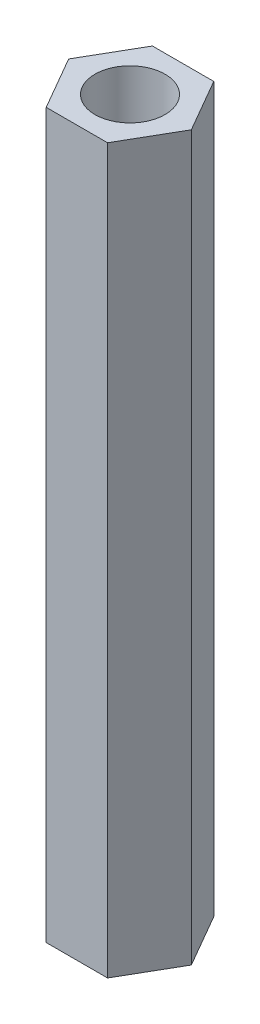
ISO-10303-21;
HEADER;
FILE_DESCRIPTION(('STEP AP214'),'2;1');
FILE_NAME('part.step','',(''),(''),'','','');
FILE_SCHEMA(('AUTOMOTIVE_DESIGN { 1 0 10303 214 1 1 1 1 }'));
ENDSEC;
DATA;
#1=APPLICATION_CONTEXT('core data for automotive mechanical design processes');
#2=APPLICATION_PROTOCOL_DEFINITION('international standard','automotive_design',2000,#1);
#3=PRODUCT_CONTEXT('',#1,'mechanical');
#4=PRODUCT('Part','Part','',(#3));
#5=PRODUCT_RELATED_PRODUCT_CATEGORY('part','',(#4));
#6=PRODUCT_DEFINITION_FORMATION('','',#4);
#7=PRODUCT_DEFINITION_CONTEXT('part definition',#1,'design');
#8=PRODUCT_DEFINITION('design','',#6,#7);
#9=PRODUCT_DEFINITION_SHAPE('','',#8);
#10=(LENGTH_UNIT() NAMED_UNIT(*) SI_UNIT(.MILLI.,.METRE.));
#11=(NAMED_UNIT(*) PLANE_ANGLE_UNIT() SI_UNIT($,.RADIAN.));
#12=(NAMED_UNIT(*) SI_UNIT($,.STERADIAN.) SOLID_ANGLE_UNIT());
#13=UNCERTAINTY_MEASURE_WITH_UNIT(LENGTH_MEASURE(1.E-05),#10,'distance_accuracy_value','');
#14=(GEOMETRIC_REPRESENTATION_CONTEXT(3) GLOBAL_UNCERTAINTY_ASSIGNED_CONTEXT((#13)) GLOBAL_UNIT_ASSIGNED_CONTEXT((#10,
#11,#12)) REPRESENTATION_CONTEXT('',''));
#15=CARTESIAN_POINT('',(0.,0.,0.));
#16=DIRECTION('',(0.,0.,1.));
#17=DIRECTION('',(1.,0.,0.));
#18=AXIS2_PLACEMENT_3D('',#15,#16,#17);
#19=CARTESIAN_POINT('',(0.,32.,0.));
#20=DIRECTION('',(0.,1.,0.));
#21=DIRECTION('',(0.,0.,1.));
#22=AXIS2_PLACEMENT_3D('',#19,#20,#21);
#23=PLANE('',#22);
#24=DIRECTION('',(0.5,0.,-0.866025403784439));
#25=VECTOR('',#24,1.);
#26=CARTESIAN_POINT('',(1.35677313259562,32.,2.35));
#27=LINE('',#26,#25);
#28=CARTESIAN_POINT('',(1.35677313259562,32.,2.35));
#29=VERTEX_POINT('',#28);
#30=CARTESIAN_POINT('',(2.71354626519124,32.,0.));
#31=VERTEX_POINT('',#30);
#32=EDGE_CURVE('E146',#29,#31,#27,.T.);
#33=ORIENTED_EDGE('',*,*,#32,.T.);
#34=DIRECTION('',(-0.5,0.,-0.866025403784438));
#35=VECTOR('',#34,1.);
#36=CARTESIAN_POINT('',(2.71354626519124,32.,0.));
#37=LINE('',#36,#35);
#38=CARTESIAN_POINT('',(1.35677313259562,32.,-2.35));
#39=VERTEX_POINT('',#38);
#40=EDGE_CURVE('E94',#31,#39,#37,.T.);
#41=ORIENTED_EDGE('',*,*,#40,.T.);
#42=DIRECTION('',(-1.,0.,0.));
#43=VECTOR('',#42,1.);
#44=CARTESIAN_POINT('',(1.35677313259562,32.,-2.35));
#45=LINE('',#44,#43);
#46=CARTESIAN_POINT('',(-1.35677313259562,32.,-2.35));
#47=VERTEX_POINT('',#46);
#48=EDGE_CURVE('E107',#39,#47,#45,.T.);
#49=ORIENTED_EDGE('',*,*,#48,.T.);
#50=DIRECTION('',(-0.5,0.,0.866025403784439));
#51=VECTOR('',#50,1.);
#52=CARTESIAN_POINT('',(-1.35677313259562,32.,-2.35));
#53=LINE('',#52,#51);
#54=CARTESIAN_POINT('',(-2.71354626519124,32.,0.));
#55=VERTEX_POINT('',#54);
#56=EDGE_CURVE('E101',#47,#55,#53,.T.);
#57=ORIENTED_EDGE('',*,*,#56,.T.);
#58=DIRECTION('',(0.5,0.,0.866025403784438));
#59=VECTOR('',#58,1.);
#60=CARTESIAN_POINT('',(-2.71354626519124,32.,0.));
#61=LINE('',#60,#59);
#62=CARTESIAN_POINT('',(-1.35677313259562,32.,2.35));
#63=VERTEX_POINT('',#62);
#64=EDGE_CURVE('E105',#55,#63,#61,.T.);
#65=ORIENTED_EDGE('',*,*,#64,.T.);
#66=DIRECTION('',(1.,0.,0.));
#67=VECTOR('',#66,1.);
#68=CARTESIAN_POINT('',(-1.35677313259562,32.,2.35));
#69=LINE('',#68,#67);
#70=EDGE_CURVE('E57',#63,#29,#69,.T.);
#71=ORIENTED_EDGE('',*,*,#70,.T.);
#72=EDGE_LOOP('',(#33,#41,#49,#57,#65,#71));
#73=FACE_BOUND('',#72,.T.);
#74=CARTESIAN_POINT('',(0.,32.,0.));
#75=DIRECTION('',(0.,1.,0.));
#76=DIRECTION('',(0.,0.,1.));
#77=AXIS2_PLACEMENT_3D('',#74,#75,#76);
#78=CIRCLE('',#77,1.55);
#79=CARTESIAN_POINT('',(0.,32.,1.55));
#80=VERTEX_POINT('',#79);
#81=EDGE_CURVE('E134',#80,#80,#78,.T.);
#82=ORIENTED_EDGE('',*,*,#81,.F.);
#83=EDGE_LOOP('',(#82));
#84=FACE_BOUND('',#83,.T.);
#85=ADVANCED_FACE('F39',(#73,#84),#23,.T.);
#86=CARTESIAN_POINT('',(0.,0.,0.));
#87=DIRECTION('',(0.,1.,0.));
#88=DIRECTION('',(0.,0.,1.));
#89=AXIS2_PLACEMENT_3D('',#86,#87,#88);
#90=PLANE('',#89);
#91=DIRECTION('',(0.5,0.,-0.866025403784439));
#92=VECTOR('',#91,1.);
#93=CARTESIAN_POINT('',(1.35677313259562,0.,2.35));
#94=LINE('',#93,#92);
#95=CARTESIAN_POINT('',(1.35677313259562,0.,2.35));
#96=VERTEX_POINT('',#95);
#97=CARTESIAN_POINT('',(2.71354626519124,0.,0.));
#98=VERTEX_POINT('',#97);
#99=EDGE_CURVE('E129',#96,#98,#94,.T.);
#100=ORIENTED_EDGE('',*,*,#99,.F.);
#101=DIRECTION('',(1.,0.,0.));
#102=VECTOR('',#101,1.);
#103=CARTESIAN_POINT('',(-1.35677313259562,0.,2.35));
#104=LINE('',#103,#102);
#105=CARTESIAN_POINT('',(-1.35677313259562,0.,2.35));
#106=VERTEX_POINT('',#105);
#107=EDGE_CURVE('E86',#106,#96,#104,.T.);
#108=ORIENTED_EDGE('',*,*,#107,.F.);
#109=DIRECTION('',(0.5,0.,0.866025403784438));
#110=VECTOR('',#109,1.);
#111=CARTESIAN_POINT('',(-2.71354626519124,0.,0.));
#112=LINE('',#111,#110);
#113=CARTESIAN_POINT('',(-2.71354626519124,0.,0.));
#114=VERTEX_POINT('',#113);
#115=EDGE_CURVE('E80',#114,#106,#112,.T.);
#116=ORIENTED_EDGE('',*,*,#115,.F.);
#117=DIRECTION('',(-0.5,0.,0.866025403784439));
#118=VECTOR('',#117,1.);
#119=CARTESIAN_POINT('',(-1.35677313259562,0.,-2.35));
#120=LINE('',#119,#118);
#121=CARTESIAN_POINT('',(-1.35677313259562,0.,-2.35));
#122=VERTEX_POINT('',#121);
#123=EDGE_CURVE('E116',#122,#114,#120,.T.);
#124=ORIENTED_EDGE('',*,*,#123,.F.);
#125=DIRECTION('',(-1.,0.,0.));
#126=VECTOR('',#125,1.);
#127=CARTESIAN_POINT('',(1.35677313259562,0.,-2.35));
#128=LINE('',#127,#126);
#129=CARTESIAN_POINT('',(1.35677313259562,0.,-2.35));
#130=VERTEX_POINT('',#129);
#131=EDGE_CURVE('E137',#130,#122,#128,.T.);
#132=ORIENTED_EDGE('',*,*,#131,.F.);
#133=DIRECTION('',(-0.5,0.,-0.866025403784438));
#134=VECTOR('',#133,1.);
#135=CARTESIAN_POINT('',(2.71354626519124,0.,0.));
#136=LINE('',#135,#134);
#137=EDGE_CURVE('E133',#98,#130,#136,.T.);
#138=ORIENTED_EDGE('',*,*,#137,.F.);
#139=EDGE_LOOP('',(#100,#108,#116,#124,#132,#138));
#140=FACE_BOUND('',#139,.T.);
#141=CARTESIAN_POINT('',(0.,0.,0.));
#142=DIRECTION('',(0.,1.,0.));
#143=DIRECTION('',(0.,0.,1.));
#144=AXIS2_PLACEMENT_3D('',#141,#142,#143);
#145=CIRCLE('',#144,1.55);
#146=CARTESIAN_POINT('',(0.,0.,1.55));
#147=VERTEX_POINT('',#146);
#148=EDGE_CURVE('E243',#147,#147,#145,.T.);
#149=ORIENTED_EDGE('',*,*,#148,.T.);
#150=EDGE_LOOP('',(#149));
#151=FACE_BOUND('',#150,.T.);
#152=ADVANCED_FACE('F159',(#140,#151),#90,.F.);
#153=CARTESIAN_POINT('',(1.35677313259562,32.,2.35));
#154=DIRECTION('',(-0.866025403784439,0.,-0.5));
#155=DIRECTION('',(-0.5,0.,0.866025403784439));
#156=AXIS2_PLACEMENT_3D('',#153,#154,#155);
#157=PLANE('',#156);
#158=ORIENTED_EDGE('',*,*,#99,.T.);
#159=DIRECTION('',(0.,-1.,0.));
#160=VECTOR('',#159,1.);
#161=CARTESIAN_POINT('',(2.71354626519124,32.,0.));
#162=LINE('',#161,#160);
#163=EDGE_CURVE('E11',#31,#98,#162,.T.);
#164=ORIENTED_EDGE('',*,*,#163,.F.);
#165=ORIENTED_EDGE('',*,*,#32,.F.);
#166=DIRECTION('',(0.,-1.,0.));
#167=VECTOR('',#166,1.);
#168=CARTESIAN_POINT('',(1.35677313259562,32.,2.35));
#169=LINE('',#168,#167);
#170=EDGE_CURVE('E125',#29,#96,#169,.T.);
#171=ORIENTED_EDGE('',*,*,#170,.T.);
#172=EDGE_LOOP('',(#158,#164,#165,#171));
#173=FACE_BOUND('',#172,.T.);
#174=ADVANCED_FACE('F41',(#173),#157,.F.);
#175=CARTESIAN_POINT('',(2.71354626519124,32.,0.));
#176=DIRECTION('',(-0.866025403784438,0.,0.5));
#177=DIRECTION('',(0.5,0.,0.866025403784438));
#178=AXIS2_PLACEMENT_3D('',#175,#176,#177);
#179=PLANE('',#178);
#180=ORIENTED_EDGE('',*,*,#137,.T.);
#181=DIRECTION('',(0.,-1.,0.));
#182=VECTOR('',#181,1.);
#183=CARTESIAN_POINT('',(1.35677313259562,32.,-2.35));
#184=LINE('',#183,#182);
#185=EDGE_CURVE('E49',#39,#130,#184,.T.);
#186=ORIENTED_EDGE('',*,*,#185,.F.);
#187=ORIENTED_EDGE('',*,*,#40,.F.);
#188=ORIENTED_EDGE('',*,*,#163,.T.);
#189=EDGE_LOOP('',(#180,#186,#187,#188));
#190=FACE_BOUND('',#189,.T.);
#191=ADVANCED_FACE('F184',(#190),#179,.F.);
#192=CARTESIAN_POINT('',(1.35677313259562,32.,-2.35));
#193=DIRECTION('',(0.,0.,1.));
#194=DIRECTION('',(1.,0.,0.));
#195=AXIS2_PLACEMENT_3D('',#192,#193,#194);
#196=PLANE('',#195);
#197=ORIENTED_EDGE('',*,*,#131,.T.);
#198=DIRECTION('',(0.,-1.,0.));
#199=VECTOR('',#198,1.);
#200=CARTESIAN_POINT('',(-1.35677313259562,32.,-2.35));
#201=LINE('',#200,#199);
#202=EDGE_CURVE('E118',#47,#122,#201,.T.);
#203=ORIENTED_EDGE('',*,*,#202,.F.);
#204=ORIENTED_EDGE('',*,*,#48,.F.);
#205=ORIENTED_EDGE('',*,*,#185,.T.);
#206=EDGE_LOOP('',(#197,#203,#204,#205));
#207=FACE_BOUND('',#206,.T.);
#208=ADVANCED_FACE('F156',(#207),#196,.F.);
#209=CARTESIAN_POINT('',(-1.35677313259562,32.,-2.35));
#210=DIRECTION('',(0.866025403784439,0.,0.5));
#211=DIRECTION('',(0.5,0.,-0.866025403784439));
#212=AXIS2_PLACEMENT_3D('',#209,#210,#211);
#213=PLANE('',#212);
#214=ORIENTED_EDGE('',*,*,#123,.T.);
#215=DIRECTION('',(0.,-1.,0.));
#216=VECTOR('',#215,1.);
#217=CARTESIAN_POINT('',(-2.71354626519124,32.,0.));
#218=LINE('',#217,#216);
#219=EDGE_CURVE('E113',#55,#114,#218,.T.);
#220=ORIENTED_EDGE('',*,*,#219,.F.);
#221=ORIENTED_EDGE('',*,*,#56,.F.);
#222=ORIENTED_EDGE('',*,*,#202,.T.);
#223=EDGE_LOOP('',(#214,#220,#221,#222));
#224=FACE_BOUND('',#223,.T.);
#225=ADVANCED_FACE('F114',(#224),#213,.F.);
#226=CARTESIAN_POINT('',(-2.71354626519124,32.,0.));
#227=DIRECTION('',(0.866025403784438,0.,-0.5));
#228=DIRECTION('',(-0.5,0.,-0.866025403784439));
#229=AXIS2_PLACEMENT_3D('',#226,#227,#228);
#230=PLANE('',#229);
#231=ORIENTED_EDGE('',*,*,#115,.T.);
#232=DIRECTION('',(0.,-1.,0.));
#233=VECTOR('',#232,1.);
#234=CARTESIAN_POINT('',(-1.35677313259562,32.,2.35));
#235=LINE('',#234,#233);
#236=EDGE_CURVE('E119',#63,#106,#235,.T.);
#237=ORIENTED_EDGE('',*,*,#236,.F.);
#238=ORIENTED_EDGE('',*,*,#64,.F.);
#239=ORIENTED_EDGE('',*,*,#219,.T.);
#240=EDGE_LOOP('',(#231,#237,#238,#239));
#241=FACE_BOUND('',#240,.T.);
#242=ADVANCED_FACE('F121',(#241),#230,.F.);
#243=CARTESIAN_POINT('',(-1.35677313259562,32.,2.35));
#244=DIRECTION('',(0.,0.,-1.));
#245=DIRECTION('',(-1.,0.,0.));
#246=AXIS2_PLACEMENT_3D('',#243,#244,#245);
#247=PLANE('',#246);
#248=ORIENTED_EDGE('',*,*,#107,.T.);
#249=ORIENTED_EDGE('',*,*,#170,.F.);
#250=ORIENTED_EDGE('',*,*,#70,.F.);
#251=ORIENTED_EDGE('',*,*,#236,.T.);
#252=EDGE_LOOP('',(#248,#249,#250,#251));
#253=FACE_BOUND('',#252,.T.);
#254=ADVANCED_FACE('F164',(#253),#247,.F.);
#255=CARTESIAN_POINT('',(0.,32.,0.));
#256=DIRECTION('',(0.,-1.,0.));
#257=DIRECTION('',(0.,0.,-1.));
#258=AXIS2_PLACEMENT_3D('',#255,#256,#257);
#259=CYLINDRICAL_SURFACE('',#258,1.55);
#260=ORIENTED_EDGE('',*,*,#81,.T.);
#261=EDGE_LOOP('',(#260));
#262=FACE_BOUND('',#261,.T.);
#263=ORIENTED_EDGE('',*,*,#148,.F.);
#264=EDGE_LOOP('',(#263));
#265=FACE_BOUND('',#264,.T.);
#266=ADVANCED_FACE('F166',(#262,#265),#259,.F.);
#267=CLOSED_SHELL('',(#85,#152,#174,#191,#208,#225,#242,#254,#266));
#268=MANIFOLD_SOLID_BREP('B2',#267);
#269=ADVANCED_BREP_SHAPE_REPRESENTATION('',(#18,#268),#14);
#270=SHAPE_DEFINITION_REPRESENTATION(#9,#269);
ENDSEC;
END-ISO-10303-21;
